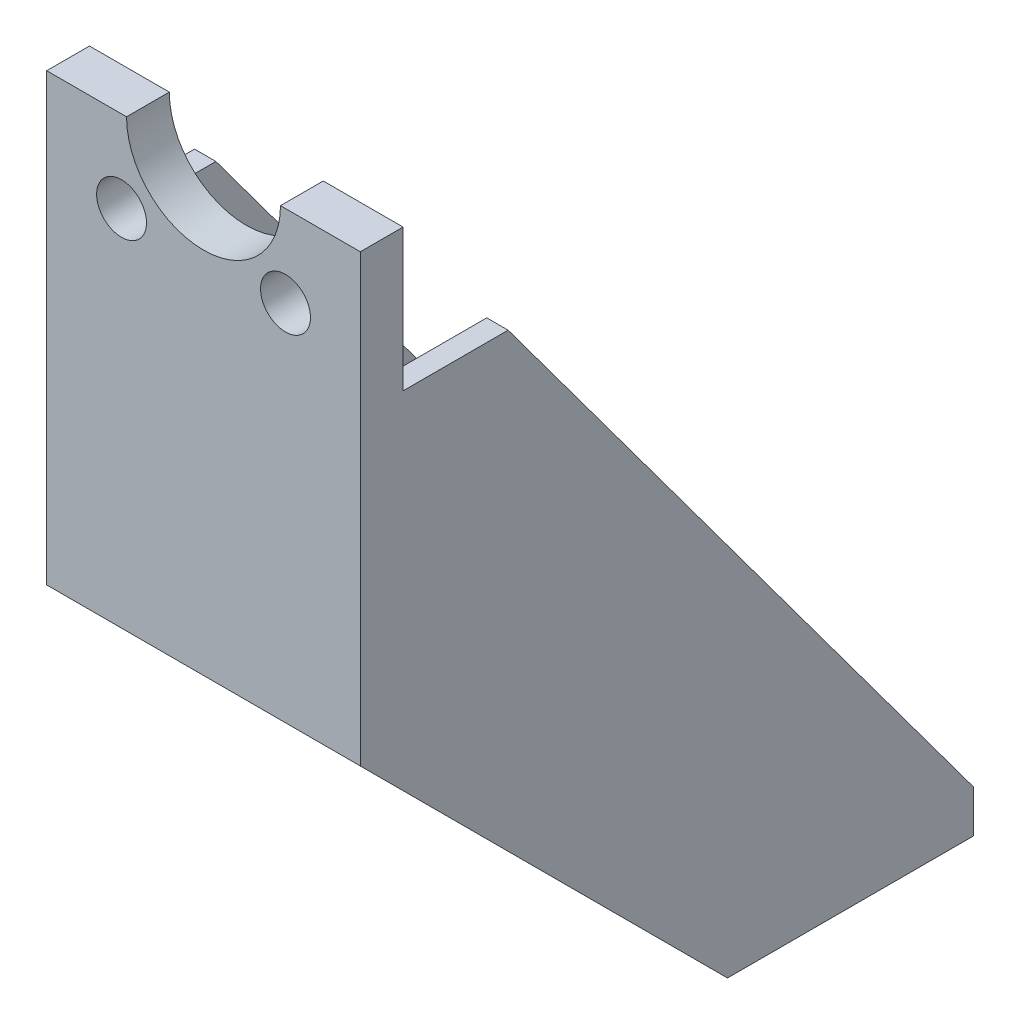
ISO-10303-21;
HEADER;
FILE_DESCRIPTION(('STEP AP214'),'2;1');
FILE_NAME('part.step','',(''),(''),'','','');
FILE_SCHEMA(('AUTOMOTIVE_DESIGN { 1 0 10303 214 1 1 1 1 }'));
ENDSEC;
DATA;
#1=APPLICATION_CONTEXT('core data for automotive mechanical design processes');
#2=APPLICATION_PROTOCOL_DEFINITION('international standard','automotive_design',2000,#1);
#3=PRODUCT_CONTEXT('',#1,'mechanical');
#4=PRODUCT('Part','Part','',(#3));
#5=PRODUCT_RELATED_PRODUCT_CATEGORY('part','',(#4));
#6=PRODUCT_DEFINITION_FORMATION('','',#4);
#7=PRODUCT_DEFINITION_CONTEXT('part definition',#1,'design');
#8=PRODUCT_DEFINITION('design','',#6,#7);
#9=PRODUCT_DEFINITION_SHAPE('','',#8);
#10=(LENGTH_UNIT() NAMED_UNIT(*) SI_UNIT(.MILLI.,.METRE.));
#11=(NAMED_UNIT(*) PLANE_ANGLE_UNIT() SI_UNIT($,.RADIAN.));
#12=(NAMED_UNIT(*) SI_UNIT($,.STERADIAN.) SOLID_ANGLE_UNIT());
#13=UNCERTAINTY_MEASURE_WITH_UNIT(LENGTH_MEASURE(1.E-05),#10,'distance_accuracy_value','');
#14=(GEOMETRIC_REPRESENTATION_CONTEXT(3) GLOBAL_UNCERTAINTY_ASSIGNED_CONTEXT((#13)) GLOBAL_UNIT_ASSIGNED_CONTEXT((#10,
#11,#12)) REPRESENTATION_CONTEXT('',''));
#15=CARTESIAN_POINT('',(0.,0.,0.));
#16=DIRECTION('',(0.,0.,1.));
#17=DIRECTION('',(1.,0.,0.));
#18=AXIS2_PLACEMENT_3D('',#15,#16,#17);
#19=CARTESIAN_POINT('',(0.,0.,0.));
#20=DIRECTION('',(0.,0.,1.));
#21=DIRECTION('',(1.,0.,0.));
#22=AXIS2_PLACEMENT_3D('',#19,#20,#21);
#23=PLANE('',#22);
#24=DIRECTION('',(0.,1.,0.));
#25=VECTOR('',#24,1.);
#26=CARTESIAN_POINT('',(-9.5,0.,0.));
#27=LINE('',#26,#25);
#28=CARTESIAN_POINT('',(-9.5,-30.,0.));
#29=VERTEX_POINT('',#28);
#30=CARTESIAN_POINT('',(-9.5,-9.9494036508787,0.));
#31=VERTEX_POINT('',#30);
#32=EDGE_CURVE('E150',#29,#31,#27,.T.);
#33=ORIENTED_EDGE('',*,*,#32,.T.);
#34=DIRECTION('',(-1.,0.,0.));
#35=VECTOR('',#34,1.);
#36=CARTESIAN_POINT('',(11.,-9.9494036508787,0.));
#37=LINE('',#36,#35);
#38=CARTESIAN_POINT('',(-11.,-9.9494036508787,0.));
#39=VERTEX_POINT('',#38);
#40=EDGE_CURVE('E142',#31,#39,#37,.T.);
#41=ORIENTED_EDGE('',*,*,#40,.T.);
#42=DIRECTION('',(0.,1.,0.));
#43=VECTOR('',#42,1.);
#44=CARTESIAN_POINT('',(-11.,0.,0.));
#45=LINE('',#44,#43);
#46=CARTESIAN_POINT('',(-11.,0.,0.));
#47=VERTEX_POINT('',#46);
#48=EDGE_CURVE('E147',#39,#47,#45,.T.);
#49=ORIENTED_EDGE('',*,*,#48,.T.);
#50=DIRECTION('',(-1.,0.,0.));
#51=VECTOR('',#50,1.);
#52=CARTESIAN_POINT('',(5.4,0.,0.));
#53=LINE('',#52,#51);
#54=CARTESIAN_POINT('',(-5.4,-1.10430566917124E-13,0.));
#55=VERTEX_POINT('',#54);
#56=EDGE_CURVE('E214',#55,#47,#53,.T.);
#57=ORIENTED_EDGE('',*,*,#56,.F.);
#58=CARTESIAN_POINT('',(0.,0.,0.));
#59=DIRECTION('',(0.,0.,1.));
#60=DIRECTION('',(1.,0.,0.));
#61=AXIS2_PLACEMENT_3D('',#58,#59,#60);
#62=CIRCLE('',#61,5.4);
#63=CARTESIAN_POINT('',(5.4,0.,0.));
#64=VERTEX_POINT('',#63);
#65=EDGE_CURVE('E265',#55,#64,#62,.T.);
#66=ORIENTED_EDGE('',*,*,#65,.T.);
#67=CARTESIAN_POINT('',(11.,0.,0.));
#68=VERTEX_POINT('',#67);
#69=EDGE_CURVE('E219',#68,#64,#53,.T.);
#70=ORIENTED_EDGE('',*,*,#69,.F.);
#71=DIRECTION('',(0.,1.,0.));
#72=VECTOR('',#71,1.);
#73=CARTESIAN_POINT('',(11.,0.,0.));
#74=LINE('',#73,#72);
#75=CARTESIAN_POINT('',(11.,-9.9494036508787,0.));
#76=VERTEX_POINT('',#75);
#77=EDGE_CURVE('E152',#76,#68,#74,.T.);
#78=ORIENTED_EDGE('',*,*,#77,.F.);
#79=CARTESIAN_POINT('',(9.5,-9.9494036508787,0.));
#80=VERTEX_POINT('',#79);
#81=EDGE_CURVE('E151',#76,#80,#37,.T.);
#82=ORIENTED_EDGE('',*,*,#81,.T.);
#83=DIRECTION('',(0.,-1.,0.));
#84=VECTOR('',#83,1.);
#85=CARTESIAN_POINT('',(9.5,0.,0.));
#86=LINE('',#85,#84);
#87=CARTESIAN_POINT('',(9.5,-30.,0.));
#88=VERTEX_POINT('',#87);
#89=EDGE_CURVE('E200',#80,#88,#86,.T.);
#90=ORIENTED_EDGE('',*,*,#89,.T.);
#91=DIRECTION('',(1.,0.,0.));
#92=VECTOR('',#91,1.);
#93=CARTESIAN_POINT('',(-11.,-30.,0.));
#94=LINE('',#93,#92);
#95=EDGE_CURVE('E231',#29,#88,#94,.T.);
#96=ORIENTED_EDGE('',*,*,#95,.F.);
#97=EDGE_LOOP('',(#33,#41,#49,#57,#66,#70,#78,#82,#90,#96));
#98=FACE_BOUND('',#97,.T.);
#99=CARTESIAN_POINT('',(5.74999999999998,-5.74999999999996,0.));
#100=DIRECTION('',(0.,0.,1.));
#101=DIRECTION('',(1.,0.,0.));
#102=AXIS2_PLACEMENT_3D('',#99,#100,#101);
#103=CIRCLE('',#102,1.75);
#104=CARTESIAN_POINT('',(7.49999999999998,-5.74999999999996,0.));
#105=VERTEX_POINT('',#104);
#106=EDGE_CURVE('E270',#105,#105,#103,.T.);
#107=ORIENTED_EDGE('',*,*,#106,.T.);
#108=EDGE_LOOP('',(#107));
#109=FACE_BOUND('',#108,.T.);
#110=CARTESIAN_POINT('',(-5.75000000000002,-5.74999999999991,0.));
#111=DIRECTION('',(0.,0.,1.));
#112=DIRECTION('',(1.,0.,0.));
#113=AXIS2_PLACEMENT_3D('',#110,#111,#112);
#114=CIRCLE('',#113,1.75);
#115=CARTESIAN_POINT('',(-4.00000000000002,-5.74999999999991,0.));
#116=VERTEX_POINT('',#115);
#117=EDGE_CURVE('E279',#116,#116,#114,.T.);
#118=ORIENTED_EDGE('',*,*,#117,.T.);
#119=EDGE_LOOP('',(#118));
#120=FACE_BOUND('',#119,.T.);
#121=ADVANCED_FACE('F36',(#98,#109,#120),#23,.F.);
#122=CARTESIAN_POINT('',(51.1123422402632,-53.9999999999999,0.));
#123=DIRECTION('',(0.,1.,0.));
#124=DIRECTION('',(-1.,0.,0.));
#125=AXIS2_PLACEMENT_3D('',#122,#123,#124);
#126=PLANE('',#125);
#127=DIRECTION('',(0.,0.,-1.));
#128=VECTOR('',#127,1.);
#129=CARTESIAN_POINT('',(-9.5,-53.9999999999999,0.));
#130=LINE('',#129,#128);
#131=CARTESIAN_POINT('',(-9.5,-53.9999999999999,-24.));
#132=VERTEX_POINT('',#131);
#133=CARTESIAN_POINT('',(-9.5,-53.9999999999999,-40.));
#134=VERTEX_POINT('',#133);
#135=EDGE_CURVE('E185',#132,#134,#130,.T.);
#136=ORIENTED_EDGE('',*,*,#135,.F.);
#137=DIRECTION('',(1.,0.,0.));
#138=VECTOR('',#137,1.);
#139=CARTESIAN_POINT('',(-11.,-53.9999999999999,-24.));
#140=LINE('',#139,#138);
#141=CARTESIAN_POINT('',(9.5,-53.9999999999999,-24.));
#142=VERTEX_POINT('',#141);
#143=EDGE_CURVE('E229',#132,#142,#140,.T.);
#144=ORIENTED_EDGE('',*,*,#143,.T.);
#145=DIRECTION('',(0.,0.,1.));
#146=VECTOR('',#145,1.);
#147=CARTESIAN_POINT('',(9.5,-53.9999999999999,0.));
#148=LINE('',#147,#146);
#149=CARTESIAN_POINT('',(9.5,-53.9999999999999,-40.));
#150=VERTEX_POINT('',#149);
#151=EDGE_CURVE('E197',#150,#142,#148,.T.);
#152=ORIENTED_EDGE('',*,*,#151,.F.);
#153=DIRECTION('',(-1.,0.,0.));
#154=VECTOR('',#153,1.);
#155=CARTESIAN_POINT('',(51.1123422402632,-53.9999999999999,-40.));
#156=LINE('',#155,#154);
#157=EDGE_CURVE('E247',#150,#134,#156,.T.);
#158=ORIENTED_EDGE('',*,*,#157,.T.);
#159=EDGE_LOOP('',(#136,#144,#152,#158));
#160=FACE_BOUND('',#159,.T.);
#161=CARTESIAN_POINT('',(5.,-53.9999999999999,-33.63));
#162=DIRECTION('',(0.,1.,0.));
#163=DIRECTION('',(-1.,0.,0.));
#164=AXIS2_PLACEMENT_3D('',#161,#162,#163);
#165=CIRCLE('',#164,1.75);
#166=CARTESIAN_POINT('',(3.25,-53.9999999999999,-33.63));
#167=VERTEX_POINT('',#166);
#168=EDGE_CURVE('E205',#167,#167,#165,.T.);
#169=ORIENTED_EDGE('',*,*,#168,.F.);
#170=EDGE_LOOP('',(#169));
#171=FACE_BOUND('',#170,.T.);
#172=CARTESIAN_POINT('',(-5.,-53.9999999999999,-33.63));
#173=DIRECTION('',(0.,1.,0.));
#174=DIRECTION('',(-1.,0.,0.));
#175=AXIS2_PLACEMENT_3D('',#172,#173,#174);
#176=CIRCLE('',#175,1.75);
#177=CARTESIAN_POINT('',(-6.75,-53.9999999999999,-33.63));
#178=VERTEX_POINT('',#177);
#179=EDGE_CURVE('E211',#178,#178,#176,.T.);
#180=ORIENTED_EDGE('',*,*,#179,.F.);
#181=EDGE_LOOP('',(#180));
#182=FACE_BOUND('',#181,.T.);
#183=CARTESIAN_POINT('',(0.,-53.9999999999999,-33.63));
#184=DIRECTION('',(0.,1.,0.));
#185=DIRECTION('',(-1.,0.,0.));
#186=AXIS2_PLACEMENT_3D('',#183,#184,#185);
#187=CIRCLE('',#186,1.75);
#188=CARTESIAN_POINT('',(-1.75,-53.9999999999999,-33.63));
#189=VERTEX_POINT('',#188);
#190=EDGE_CURVE('E238',#189,#189,#187,.T.);
#191=ORIENTED_EDGE('',*,*,#190,.F.);
#192=EDGE_LOOP('',(#191));
#193=FACE_BOUND('',#192,.T.);
#194=ADVANCED_FACE('F292',(#160,#171,#182,#193),#126,.T.);
#195=CARTESIAN_POINT('',(0.,0.,3.));
#196=DIRECTION('',(0.,0.,-1.));
#197=DIRECTION('',(-1.,0.,0.));
#198=AXIS2_PLACEMENT_3D('',#195,#196,#197);
#199=CYLINDRICAL_SURFACE('',#198,5.4);
#200=ORIENTED_EDGE('',*,*,#65,.F.);
#201=DIRECTION('',(0.,0.,-1.));
#202=VECTOR('',#201,1.);
#203=CARTESIAN_POINT('',(-5.4,0.,3.));
#204=LINE('',#203,#202);
#205=CARTESIAN_POINT('',(-5.4,0.,3.));
#206=VERTEX_POINT('',#205);
#207=EDGE_CURVE('E276',#206,#55,#204,.T.);
#208=ORIENTED_EDGE('',*,*,#207,.F.);
#209=CARTESIAN_POINT('',(0.,0.,3.));
#210=DIRECTION('',(0.,0.,1.));
#211=DIRECTION('',(1.,0.,0.));
#212=AXIS2_PLACEMENT_3D('',#209,#210,#211);
#213=CIRCLE('',#212,5.4);
#214=CARTESIAN_POINT('',(5.4,0.,3.));
#215=VERTEX_POINT('',#214);
#216=EDGE_CURVE('E266',#206,#215,#213,.T.);
#217=ORIENTED_EDGE('',*,*,#216,.T.);
#218=DIRECTION('',(0.,0.,-1.));
#219=VECTOR('',#218,1.);
#220=CARTESIAN_POINT('',(5.4,0.,3.));
#221=LINE('',#220,#219);
#222=EDGE_CURVE('E44',#215,#64,#221,.T.);
#223=ORIENTED_EDGE('',*,*,#222,.T.);
#224=EDGE_LOOP('',(#200,#208,#217,#223));
#225=FACE_BOUND('',#224,.T.);
#226=ADVANCED_FACE('F38',(#225),#199,.F.);
#227=CARTESIAN_POINT('',(-5.75000000000002,-5.74999999999991,3.));
#228=DIRECTION('',(0.,0.,-1.));
#229=DIRECTION('',(-1.,0.,0.));
#230=AXIS2_PLACEMENT_3D('',#227,#228,#229);
#231=CYLINDRICAL_SURFACE('',#230,1.75);
#232=CARTESIAN_POINT('',(-5.75000000000002,-5.74999999999991,3.));
#233=DIRECTION('',(0.,0.,1.));
#234=DIRECTION('',(1.,0.,0.));
#235=AXIS2_PLACEMENT_3D('',#232,#233,#234);
#236=CIRCLE('',#235,1.75);
#237=CARTESIAN_POINT('',(-4.00000000000002,-5.74999999999991,3.));
#238=VERTEX_POINT('',#237);
#239=EDGE_CURVE('E269',#238,#238,#236,.T.);
#240=ORIENTED_EDGE('',*,*,#239,.T.);
#241=EDGE_LOOP('',(#240));
#242=FACE_BOUND('',#241,.T.);
#243=ORIENTED_EDGE('',*,*,#117,.F.);
#244=EDGE_LOOP('',(#243));
#245=FACE_BOUND('',#244,.T.);
#246=ADVANCED_FACE('F300',(#242,#245),#231,.F.);
#247=CARTESIAN_POINT('',(5.74999999999998,-5.74999999999996,3.));
#248=DIRECTION('',(0.,0.,-1.));
#249=DIRECTION('',(-1.,0.,0.));
#250=AXIS2_PLACEMENT_3D('',#247,#248,#249);
#251=CYLINDRICAL_SURFACE('',#250,1.75);
#252=CARTESIAN_POINT('',(5.74999999999998,-5.74999999999996,3.));
#253=DIRECTION('',(0.,0.,1.));
#254=DIRECTION('',(1.,0.,0.));
#255=AXIS2_PLACEMENT_3D('',#252,#253,#254);
#256=CIRCLE('',#255,1.75);
#257=CARTESIAN_POINT('',(7.49999999999998,-5.74999999999996,3.));
#258=VERTEX_POINT('',#257);
#259=EDGE_CURVE('E273',#258,#258,#256,.T.);
#260=ORIENTED_EDGE('',*,*,#259,.T.);
#261=EDGE_LOOP('',(#260));
#262=FACE_BOUND('',#261,.T.);
#263=ORIENTED_EDGE('',*,*,#106,.F.);
#264=EDGE_LOOP('',(#263));
#265=FACE_BOUND('',#264,.T.);
#266=ADVANCED_FACE('F321',(#262,#265),#251,.F.);
#267=CARTESIAN_POINT('',(0.,0.,3.));
#268=DIRECTION('',(0.,0.,1.));
#269=DIRECTION('',(1.,0.,0.));
#270=AXIS2_PLACEMENT_3D('',#267,#268,#269);
#271=PLANE('',#270);
#272=DIRECTION('',(-1.,0.,0.));
#273=VECTOR('',#272,1.);
#274=CARTESIAN_POINT('',(-11.,0.,3.));
#275=LINE('',#274,#273);
#276=CARTESIAN_POINT('',(-11.,0.,3.));
#277=VERTEX_POINT('',#276);
#278=EDGE_CURVE('E218',#206,#277,#275,.T.);
#279=ORIENTED_EDGE('',*,*,#278,.T.);
#280=DIRECTION('',(0.,1.,0.));
#281=VECTOR('',#280,1.);
#282=CARTESIAN_POINT('',(-11.,-56.9999999999999,3.));
#283=LINE('',#282,#281);
#284=CARTESIAN_POINT('',(-11.,-31.2426406871193,3.));
#285=VERTEX_POINT('',#284);
#286=EDGE_CURVE('E260',#285,#277,#283,.T.);
#287=ORIENTED_EDGE('',*,*,#286,.F.);
#288=DIRECTION('',(1.,0.,0.));
#289=VECTOR('',#288,1.);
#290=CARTESIAN_POINT('',(-11.,-31.2426406871193,3.));
#291=LINE('',#290,#289);
#292=CARTESIAN_POINT('',(11.,-31.2426406871193,3.));
#293=VERTEX_POINT('',#292);
#294=EDGE_CURVE('E224',#285,#293,#291,.T.);
#295=ORIENTED_EDGE('',*,*,#294,.T.);
#296=DIRECTION('',(0.,1.,0.));
#297=VECTOR('',#296,1.);
#298=CARTESIAN_POINT('',(11.,-56.9999999999999,3.));
#299=LINE('',#298,#297);
#300=CARTESIAN_POINT('',(11.,0.,3.));
#301=VERTEX_POINT('',#300);
#302=EDGE_CURVE('E262',#293,#301,#299,.T.);
#303=ORIENTED_EDGE('',*,*,#302,.T.);
#304=EDGE_CURVE('E215',#301,#215,#275,.T.);
#305=ORIENTED_EDGE('',*,*,#304,.T.);
#306=ORIENTED_EDGE('',*,*,#216,.F.);
#307=EDGE_LOOP('',(#279,#287,#295,#303,#305,#306));
#308=FACE_BOUND('',#307,.T.);
#309=ORIENTED_EDGE('',*,*,#239,.F.);
#310=EDGE_LOOP('',(#309));
#311=FACE_BOUND('',#310,.T.);
#312=ORIENTED_EDGE('',*,*,#259,.F.);
#313=EDGE_LOOP('',(#312));
#314=FACE_BOUND('',#313,.T.);
#315=ADVANCED_FACE('F319',(#308,#311,#314),#271,.T.);
#316=CARTESIAN_POINT('',(-11.,-56.9999999999999,3.));
#317=DIRECTION('',(1.,0.,0.));
#318=DIRECTION('',(0.,1.,0.));
#319=AXIS2_PLACEMENT_3D('',#316,#317,#318);
#320=PLANE('',#319);
#321=DIRECTION('',(0.,0.,-1.));
#322=VECTOR('',#321,1.);
#323=CARTESIAN_POINT('',(-11.,0.,3.));
#324=LINE('',#323,#322);
#325=EDGE_CURVE('E164',#47,#277,#324,.F.);
#326=ORIENTED_EDGE('',*,*,#325,.F.);
#327=ORIENTED_EDGE('',*,*,#48,.F.);
#328=DIRECTION('',(0.,0.,1.));
#329=VECTOR('',#328,1.);
#330=CARTESIAN_POINT('',(-11.,-9.9494036508787,0.));
#331=LINE('',#330,#329);
#332=CARTESIAN_POINT('',(-11.,-9.9494036508787,-7.36992863028053));
#333=VERTEX_POINT('',#332);
#334=EDGE_CURVE('E155',#333,#39,#331,.T.);
#335=ORIENTED_EDGE('',*,*,#334,.F.);
#336=DIRECTION('',(0.,0.803557193344745,0.595227550625738));
#337=VECTOR('',#336,1.);
#338=CARTESIAN_POINT('',(-11.,0.,0.));
#339=LINE('',#338,#337);
#340=CARTESIAN_POINT('',(-11.,-53.9999999999999,-40.));
#341=VERTEX_POINT('',#340);
#342=EDGE_CURVE('E176',#341,#333,#339,.T.);
#343=ORIENTED_EDGE('',*,*,#342,.F.);
#344=DIRECTION('',(0.,1.,0.));
#345=VECTOR('',#344,1.);
#346=CARTESIAN_POINT('',(-11.,-56.9999999999999,-40.));
#347=LINE('',#346,#345);
#348=CARTESIAN_POINT('',(-11.,-56.9999999999999,-40.));
#349=VERTEX_POINT('',#348);
#350=EDGE_CURVE('E244',#349,#341,#347,.T.);
#351=ORIENTED_EDGE('',*,*,#350,.F.);
#352=DIRECTION('',(0.,0.,-1.));
#353=VECTOR('',#352,1.);
#354=CARTESIAN_POINT('',(-11.,-56.9999999999999,3.));
#355=LINE('',#354,#353);
#356=CARTESIAN_POINT('',(-11.,-56.9999999999999,-22.7573593128808));
#357=VERTEX_POINT('',#356);
#358=EDGE_CURVE('E254',#357,#349,#355,.T.);
#359=ORIENTED_EDGE('',*,*,#358,.F.);
#360=DIRECTION('',(0.,0.707106781186546,0.707106781186549));
#361=VECTOR('',#360,1.);
#362=CARTESIAN_POINT('',(-11.,-31.2426406871193,3.));
#363=LINE('',#362,#361);
#364=EDGE_CURVE('E221',#357,#285,#363,.T.);
#365=ORIENTED_EDGE('',*,*,#364,.T.);
#366=ORIENTED_EDGE('',*,*,#286,.T.);
#367=EDGE_LOOP('',(#326,#327,#335,#343,#351,#359,#365,#366));
#368=FACE_BOUND('',#367,.T.);
#369=ADVANCED_FACE('F161',(#368),#320,.F.);
#370=CARTESIAN_POINT('',(11.,-56.9999999999999,3.));
#371=DIRECTION('',(-1.,0.,0.));
#372=DIRECTION('',(0.,-1.,0.));
#373=AXIS2_PLACEMENT_3D('',#370,#371,#372);
#374=PLANE('',#373);
#375=DIRECTION('',(0.,0.,1.));
#376=VECTOR('',#375,1.);
#377=CARTESIAN_POINT('',(11.,-9.9494036508787,0.));
#378=LINE('',#377,#376);
#379=CARTESIAN_POINT('',(11.,-9.9494036508787,-7.36992863028053));
#380=VERTEX_POINT('',#379);
#381=EDGE_CURVE('E51',#380,#76,#378,.T.);
#382=ORIENTED_EDGE('',*,*,#381,.T.);
#383=ORIENTED_EDGE('',*,*,#77,.T.);
#384=DIRECTION('',(0.,0.,-1.));
#385=VECTOR('',#384,1.);
#386=CARTESIAN_POINT('',(11.,0.,3.));
#387=LINE('',#386,#385);
#388=EDGE_CURVE('E242',#68,#301,#387,.F.);
#389=ORIENTED_EDGE('',*,*,#388,.T.);
#390=ORIENTED_EDGE('',*,*,#302,.F.);
#391=DIRECTION('',(0.,0.707106781186546,0.707106781186549));
#392=VECTOR('',#391,1.);
#393=CARTESIAN_POINT('',(11.,-44.1213203435596,-9.87867965644038));
#394=LINE('',#393,#392);
#395=CARTESIAN_POINT('',(11.,-56.9999999999999,-22.7573593128808));
#396=VERTEX_POINT('',#395);
#397=EDGE_CURVE('E217',#396,#293,#394,.T.);
#398=ORIENTED_EDGE('',*,*,#397,.F.);
#399=DIRECTION('',(0.,0.,1.));
#400=VECTOR('',#399,1.);
#401=CARTESIAN_POINT('',(11.,-56.9999999999999,3.));
#402=LINE('',#401,#400);
#403=CARTESIAN_POINT('',(11.,-56.9999999999999,-40.));
#404=VERTEX_POINT('',#403);
#405=EDGE_CURVE('E257',#404,#396,#402,.T.);
#406=ORIENTED_EDGE('',*,*,#405,.F.);
#407=DIRECTION('',(0.,-1.,0.));
#408=VECTOR('',#407,1.);
#409=CARTESIAN_POINT('',(11.,-56.9999999999999,-40.));
#410=LINE('',#409,#408);
#411=CARTESIAN_POINT('',(11.,-53.9999999999999,-40.));
#412=VERTEX_POINT('',#411);
#413=EDGE_CURVE('E239',#412,#404,#410,.T.);
#414=ORIENTED_EDGE('',*,*,#413,.F.);
#415=DIRECTION('',(0.,0.803557193344745,0.595227550625738));
#416=VECTOR('',#415,1.);
#417=CARTESIAN_POINT('',(11.,0.,0.));
#418=LINE('',#417,#416);
#419=EDGE_CURVE('E188',#412,#380,#418,.T.);
#420=ORIENTED_EDGE('',*,*,#419,.T.);
#421=EDGE_LOOP('',(#382,#383,#389,#390,#398,#406,#414,#420));
#422=FACE_BOUND('',#421,.T.);
#423=ADVANCED_FACE('F312',(#422),#374,.F.);
#424=CARTESIAN_POINT('',(0.,-56.9999999999999,0.));
#425=DIRECTION('',(0.,1.,0.));
#426=DIRECTION('',(0.,0.,1.));
#427=AXIS2_PLACEMENT_3D('',#424,#425,#426);
#428=PLANE('',#427);
#429=CARTESIAN_POINT('',(5.,-56.9999999999999,-33.63));
#430=DIRECTION('',(0.,-1.,0.));
#431=DIRECTION('',(0.,0.,1.));
#432=AXIS2_PLACEMENT_3D('',#429,#430,#431);
#433=CIRCLE('',#432,1.75);
#434=CARTESIAN_POINT('',(5.,-56.9999999999999,-31.88));
#435=VERTEX_POINT('',#434);
#436=EDGE_CURVE('E202',#435,#435,#433,.T.);
#437=ORIENTED_EDGE('',*,*,#436,.F.);
#438=EDGE_LOOP('',(#437));
#439=FACE_BOUND('',#438,.T.);
#440=CARTESIAN_POINT('',(-5.,-56.9999999999999,-33.63));
#441=DIRECTION('',(0.,-1.,0.));
#442=DIRECTION('',(0.,0.,-1.));
#443=AXIS2_PLACEMENT_3D('',#440,#441,#442);
#444=CIRCLE('',#443,1.75);
#445=CARTESIAN_POINT('',(-5.,-56.9999999999999,-35.38));
#446=VERTEX_POINT('',#445);
#447=EDGE_CURVE('E208',#446,#446,#444,.T.);
#448=ORIENTED_EDGE('',*,*,#447,.F.);
#449=EDGE_LOOP('',(#448));
#450=FACE_BOUND('',#449,.T.);
#451=CARTESIAN_POINT('',(0.,-56.9999999999999,-33.63));
#452=DIRECTION('',(0.,-1.,0.));
#453=DIRECTION('',(0.,0.,-1.));
#454=AXIS2_PLACEMENT_3D('',#451,#452,#453);
#455=CIRCLE('',#454,1.75);
#456=CARTESIAN_POINT('',(0.,-56.9999999999999,-35.38));
#457=VERTEX_POINT('',#456);
#458=EDGE_CURVE('E234',#457,#457,#455,.T.);
#459=ORIENTED_EDGE('',*,*,#458,.F.);
#460=EDGE_LOOP('',(#459));
#461=FACE_BOUND('',#460,.T.);
#462=ORIENTED_EDGE('',*,*,#405,.T.);
#463=DIRECTION('',(1.,0.,0.));
#464=VECTOR('',#463,1.);
#465=CARTESIAN_POINT('',(-11.,-56.9999999999999,-22.7573593128808));
#466=LINE('',#465,#464);
#467=EDGE_CURVE('E227',#357,#396,#466,.T.);
#468=ORIENTED_EDGE('',*,*,#467,.F.);
#469=ORIENTED_EDGE('',*,*,#358,.T.);
#470=DIRECTION('',(-1.,0.,0.));
#471=VECTOR('',#470,1.);
#472=CARTESIAN_POINT('',(51.1123422402632,-56.9999999999999,-40.));
#473=LINE('',#472,#471);
#474=EDGE_CURVE('E243',#404,#349,#473,.T.);
#475=ORIENTED_EDGE('',*,*,#474,.F.);
#476=EDGE_LOOP('',(#462,#468,#469,#475));
#477=FACE_BOUND('',#476,.T.);
#478=ADVANCED_FACE('F309',(#439,#450,#461,#477),#428,.F.);
#479=CARTESIAN_POINT('',(51.1123422402632,-56.9999999999999,-40.));
#480=DIRECTION('',(0.,0.,1.));
#481=DIRECTION('',(1.,0.,0.));
#482=AXIS2_PLACEMENT_3D('',#479,#480,#481);
#483=PLANE('',#482);
#484=ORIENTED_EDGE('',*,*,#474,.T.);
#485=ORIENTED_EDGE('',*,*,#350,.T.);
#486=DIRECTION('',(-1.,0.,0.));
#487=VECTOR('',#486,1.);
#488=CARTESIAN_POINT('',(-9.5,-53.9999999999999,-40.));
#489=LINE('',#488,#487);
#490=EDGE_CURVE('E180',#134,#341,#489,.T.);
#491=ORIENTED_EDGE('',*,*,#490,.F.);
#492=ORIENTED_EDGE('',*,*,#157,.F.);
#493=EDGE_CURVE('E249',#412,#150,#156,.T.);
#494=ORIENTED_EDGE('',*,*,#493,.F.);
#495=ORIENTED_EDGE('',*,*,#413,.T.);
#496=EDGE_LOOP('',(#484,#485,#491,#492,#494,#495));
#497=FACE_BOUND('',#496,.T.);
#498=ADVANCED_FACE('F307',(#497),#483,.F.);
#499=CARTESIAN_POINT('',(0.,-46.9999999999999,-33.63));
#500=DIRECTION('',(0.,-1.,0.));
#501=DIRECTION('',(0.,0.,-1.));
#502=AXIS2_PLACEMENT_3D('',#499,#500,#501);
#503=CYLINDRICAL_SURFACE('',#502,1.75);
#504=ORIENTED_EDGE('',*,*,#190,.T.);
#505=EDGE_LOOP('',(#504));
#506=FACE_BOUND('',#505,.T.);
#507=ORIENTED_EDGE('',*,*,#458,.T.);
#508=EDGE_LOOP('',(#507));
#509=FACE_BOUND('',#508,.T.);
#510=ADVANCED_FACE('F289',(#506,#509),#503,.F.);
#511=CARTESIAN_POINT('',(-11.,-30.,0.));
#512=DIRECTION('',(0.,0.707106781186549,-0.707106781186546));
#513=DIRECTION('',(0.,0.707106781186546,0.707106781186549));
#514=AXIS2_PLACEMENT_3D('',#511,#512,#513);
#515=PLANE('',#514);
#516=DIRECTION('',(0.,-0.707106781186546,-0.707106781186549));
#517=VECTOR('',#516,1.);
#518=CARTESIAN_POINT('',(-9.5,-30.,0.));
#519=LINE('',#518,#517);
#520=EDGE_CURVE('E183',#29,#132,#519,.T.);
#521=ORIENTED_EDGE('',*,*,#520,.F.);
#522=ORIENTED_EDGE('',*,*,#95,.T.);
#523=DIRECTION('',(0.,0.707106781186546,0.707106781186549));
#524=VECTOR('',#523,1.);
#525=CARTESIAN_POINT('',(9.5,-30.,0.));
#526=LINE('',#525,#524);
#527=EDGE_CURVE('E192',#142,#88,#526,.T.);
#528=ORIENTED_EDGE('',*,*,#527,.F.);
#529=ORIENTED_EDGE('',*,*,#143,.F.);
#530=EDGE_LOOP('',(#521,#522,#528,#529));
#531=FACE_BOUND('',#530,.T.);
#532=ADVANCED_FACE('F376',(#531),#515,.T.);
#533=CARTESIAN_POINT('',(-11.,-53.9999999999999,-19.7573593128807));
#534=DIRECTION('',(0.,-0.707106781186549,0.707106781186546));
#535=DIRECTION('',(0.,-0.707106781186546,-0.707106781186549));
#536=AXIS2_PLACEMENT_3D('',#533,#534,#535);
#537=PLANE('',#536);
#538=ORIENTED_EDGE('',*,*,#397,.T.);
#539=ORIENTED_EDGE('',*,*,#294,.F.);
#540=ORIENTED_EDGE('',*,*,#364,.F.);
#541=ORIENTED_EDGE('',*,*,#467,.T.);
#542=EDGE_LOOP('',(#538,#539,#540,#541));
#543=FACE_BOUND('',#542,.T.);
#544=ADVANCED_FACE('F381',(#543),#537,.T.);
#545=CARTESIAN_POINT('',(5.4,0.,3.));
#546=DIRECTION('',(0.,-1.,0.));
#547=DIRECTION('',(1.,0.,0.));
#548=AXIS2_PLACEMENT_3D('',#545,#546,#547);
#549=PLANE('',#548);
#550=ORIENTED_EDGE('',*,*,#222,.F.);
#551=ORIENTED_EDGE('',*,*,#304,.F.);
#552=ORIENTED_EDGE('',*,*,#388,.F.);
#553=ORIENTED_EDGE('',*,*,#69,.T.);
#554=EDGE_LOOP('',(#550,#551,#552,#553));
#555=FACE_BOUND('',#554,.T.);
#556=ADVANCED_FACE('F389',(#555),#549,.F.);
#557=ORIENTED_EDGE('',*,*,#56,.T.);
#558=ORIENTED_EDGE('',*,*,#325,.T.);
#559=ORIENTED_EDGE('',*,*,#278,.F.);
#560=ORIENTED_EDGE('',*,*,#207,.T.);
#561=EDGE_LOOP('',(#557,#558,#559,#560));
#562=FACE_BOUND('',#561,.T.);
#563=ADVANCED_FACE('F396',(#562),#549,.F.);
#564=CARTESIAN_POINT('',(-5.,0.,-33.63));
#565=DIRECTION('',(0.,-1.,0.));
#566=DIRECTION('',(0.,0.,-1.));
#567=AXIS2_PLACEMENT_3D('',#564,#565,#566);
#568=CYLINDRICAL_SURFACE('',#567,1.75);
#569=ORIENTED_EDGE('',*,*,#179,.T.);
#570=EDGE_LOOP('',(#569));
#571=FACE_BOUND('',#570,.T.);
#572=ORIENTED_EDGE('',*,*,#447,.T.);
#573=EDGE_LOOP('',(#572));
#574=FACE_BOUND('',#573,.T.);
#575=ADVANCED_FACE('F404',(#571,#574),#568,.F.);
#576=CARTESIAN_POINT('',(5.,0.,-33.63));
#577=DIRECTION('',(0.,-1.,0.));
#578=DIRECTION('',(0.,0.,-1.));
#579=AXIS2_PLACEMENT_3D('',#576,#577,#578);
#580=CYLINDRICAL_SURFACE('',#579,1.75);
#581=ORIENTED_EDGE('',*,*,#168,.T.);
#582=EDGE_LOOP('',(#581));
#583=FACE_BOUND('',#582,.T.);
#584=ORIENTED_EDGE('',*,*,#436,.T.);
#585=EDGE_LOOP('',(#584));
#586=FACE_BOUND('',#585,.T.);
#587=ADVANCED_FACE('F412',(#583,#586),#580,.F.);
#588=CARTESIAN_POINT('',(9.5,0.,0.));
#589=DIRECTION('',(-1.,0.,0.));
#590=DIRECTION('',(0.,0.,1.));
#591=AXIS2_PLACEMENT_3D('',#588,#589,#590);
#592=PLANE('',#591);
#593=DIRECTION('',(0.,0.,1.));
#594=VECTOR('',#593,1.);
#595=CARTESIAN_POINT('',(9.5,-9.9494036508787,0.));
#596=LINE('',#595,#594);
#597=CARTESIAN_POINT('',(9.5,-9.9494036508787,-7.36992863028053));
#598=VERTEX_POINT('',#597);
#599=EDGE_CURVE('E174',#598,#80,#596,.T.);
#600=ORIENTED_EDGE('',*,*,#599,.F.);
#601=DIRECTION('',(0.,0.803557193344745,0.595227550625738));
#602=VECTOR('',#601,1.);
#603=CARTESIAN_POINT('',(9.5,0.,0.));
#604=LINE('',#603,#602);
#605=EDGE_CURVE('E189',#150,#598,#604,.T.);
#606=ORIENTED_EDGE('',*,*,#605,.F.);
#607=ORIENTED_EDGE('',*,*,#151,.T.);
#608=ORIENTED_EDGE('',*,*,#527,.T.);
#609=ORIENTED_EDGE('',*,*,#89,.F.);
#610=EDGE_LOOP('',(#600,#606,#607,#608,#609));
#611=FACE_BOUND('',#610,.T.);
#612=ADVANCED_FACE('F420',(#611),#592,.T.);
#613=CARTESIAN_POINT('',(9.5,0.,0.));
#614=DIRECTION('',(0.,0.595227550625738,-0.803557193344745));
#615=DIRECTION('',(0.,0.803557193344745,0.595227550625738));
#616=AXIS2_PLACEMENT_3D('',#613,#614,#615);
#617=PLANE('',#616);
#618=DIRECTION('',(-1.,0.,0.));
#619=VECTOR('',#618,1.);
#620=CARTESIAN_POINT('',(9.5,-9.9494036508787,-7.36992863028053));
#621=LINE('',#620,#619);
#622=EDGE_CURVE('E172',#380,#598,#621,.T.);
#623=ORIENTED_EDGE('',*,*,#622,.F.);
#624=ORIENTED_EDGE('',*,*,#419,.F.);
#625=ORIENTED_EDGE('',*,*,#493,.T.);
#626=ORIENTED_EDGE('',*,*,#605,.T.);
#627=EDGE_LOOP('',(#623,#624,#625,#626));
#628=FACE_BOUND('',#627,.T.);
#629=ADVANCED_FACE('F427',(#628),#617,.T.);
#630=CARTESIAN_POINT('',(-9.5,0.,0.));
#631=DIRECTION('',(1.,0.,0.));
#632=DIRECTION('',(0.,0.,1.));
#633=AXIS2_PLACEMENT_3D('',#630,#631,#632);
#634=PLANE('',#633);
#635=DIRECTION('',(0.,0.,-1.));
#636=VECTOR('',#635,1.);
#637=CARTESIAN_POINT('',(-9.5,-9.9494036508787,0.));
#638=LINE('',#637,#636);
#639=CARTESIAN_POINT('',(-9.5,-9.9494036508787,-7.36992863028053));
#640=VERTEX_POINT('',#639);
#641=EDGE_CURVE('E59',#31,#640,#638,.T.);
#642=ORIENTED_EDGE('',*,*,#641,.F.);
#643=ORIENTED_EDGE('',*,*,#32,.F.);
#644=ORIENTED_EDGE('',*,*,#520,.T.);
#645=ORIENTED_EDGE('',*,*,#135,.T.);
#646=DIRECTION('',(0.,0.803557193344745,0.595227550625738));
#647=VECTOR('',#646,1.);
#648=CARTESIAN_POINT('',(-9.5,0.,0.));
#649=LINE('',#648,#647);
#650=EDGE_CURVE('E177',#134,#640,#649,.T.);
#651=ORIENTED_EDGE('',*,*,#650,.T.);
#652=EDGE_LOOP('',(#642,#643,#644,#645,#651));
#653=FACE_BOUND('',#652,.T.);
#654=ADVANCED_FACE('F435',(#653),#634,.T.);
#655=CARTESIAN_POINT('',(-9.5,0.,0.));
#656=DIRECTION('',(0.,-0.595227550625738,0.803557193344745));
#657=DIRECTION('',(0.,-0.803557193344745,-0.595227550625738));
#658=AXIS2_PLACEMENT_3D('',#655,#656,#657);
#659=PLANE('',#658);
#660=ORIENTED_EDGE('',*,*,#342,.T.);
#661=DIRECTION('',(1.,0.,0.));
#662=VECTOR('',#661,1.);
#663=CARTESIAN_POINT('',(-9.5,-9.9494036508787,-7.36992863028053));
#664=LINE('',#663,#662);
#665=EDGE_CURVE('E12',#333,#640,#664,.T.);
#666=ORIENTED_EDGE('',*,*,#665,.T.);
#667=ORIENTED_EDGE('',*,*,#650,.F.);
#668=ORIENTED_EDGE('',*,*,#490,.T.);
#669=EDGE_LOOP('',(#660,#666,#667,#668));
#670=FACE_BOUND('',#669,.T.);
#671=ADVANCED_FACE('F443',(#670),#659,.F.);
#672=CARTESIAN_POINT('',(11.,-9.9494036508787,0.));
#673=DIRECTION('',(0.,-1.,0.));
#674=DIRECTION('',(0.,0.,-1.));
#675=AXIS2_PLACEMENT_3D('',#672,#673,#674);
#676=PLANE('',#675);
#677=ORIENTED_EDGE('',*,*,#641,.T.);
#678=ORIENTED_EDGE('',*,*,#665,.F.);
#679=ORIENTED_EDGE('',*,*,#334,.T.);
#680=ORIENTED_EDGE('',*,*,#40,.F.);
#681=EDGE_LOOP('',(#677,#678,#679,#680));
#682=FACE_BOUND('',#681,.T.);
#683=ADVANCED_FACE('F156',(#682),#676,.F.);
#684=ORIENTED_EDGE('',*,*,#599,.T.);
#685=ORIENTED_EDGE('',*,*,#81,.F.);
#686=ORIENTED_EDGE('',*,*,#381,.F.);
#687=ORIENTED_EDGE('',*,*,#622,.T.);
#688=EDGE_LOOP('',(#684,#685,#686,#687));
#689=FACE_BOUND('',#688,.T.);
#690=ADVANCED_FACE('F458',(#689),#676,.F.);
#691=CLOSED_SHELL('',(#121,#194,#226,#246,#266,#315,#369,#423,#478,#498,#510,#532,#544,#556,
#563,#575,#587,#612,#629,#654,#671,#683,#690));
#692=MANIFOLD_SOLID_BREP('B2',#691);
#693=ADVANCED_BREP_SHAPE_REPRESENTATION('',(#18,#692),#14);
#694=SHAPE_DEFINITION_REPRESENTATION(#9,#693);
ENDSEC;
END-ISO-10303-21;
